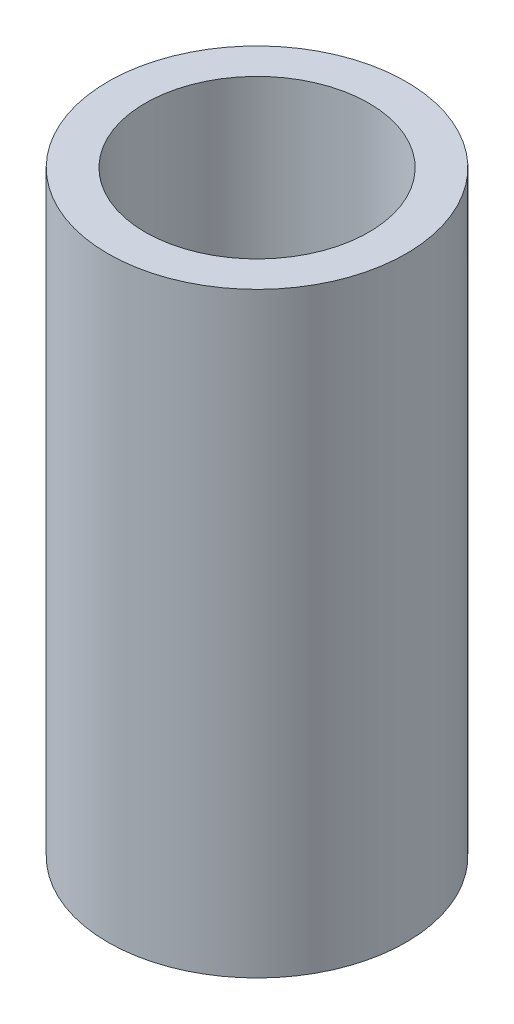
ISO-10303-21;
HEADER;
FILE_DESCRIPTION(('STEP AP214'),'2;1');
FILE_NAME('part.step','',(''),(''),'','','');
FILE_SCHEMA(('AUTOMOTIVE_DESIGN { 1 0 10303 214 1 1 1 1 }'));
ENDSEC;
DATA;
#1=APPLICATION_CONTEXT('core data for automotive mechanical design processes');
#2=APPLICATION_PROTOCOL_DEFINITION('international standard','automotive_design',2000,#1);
#3=PRODUCT_CONTEXT('',#1,'mechanical');
#4=PRODUCT('Part','Part','',(#3));
#5=PRODUCT_RELATED_PRODUCT_CATEGORY('part','',(#4));
#6=PRODUCT_DEFINITION_FORMATION('','',#4);
#7=PRODUCT_DEFINITION_CONTEXT('part definition',#1,'design');
#8=PRODUCT_DEFINITION('design','',#6,#7);
#9=PRODUCT_DEFINITION_SHAPE('','',#8);
#10=(LENGTH_UNIT() NAMED_UNIT(*) SI_UNIT(.MILLI.,.METRE.));
#11=(NAMED_UNIT(*) PLANE_ANGLE_UNIT() SI_UNIT($,.RADIAN.));
#12=(NAMED_UNIT(*) SI_UNIT($,.STERADIAN.) SOLID_ANGLE_UNIT());
#13=UNCERTAINTY_MEASURE_WITH_UNIT(LENGTH_MEASURE(1.E-05),#10,'distance_accuracy_value','');
#14=(GEOMETRIC_REPRESENTATION_CONTEXT(3) GLOBAL_UNCERTAINTY_ASSIGNED_CONTEXT((#13)) GLOBAL_UNIT_ASSIGNED_CONTEXT((#10,
#11,#12)) REPRESENTATION_CONTEXT('',''));
#15=CARTESIAN_POINT('',(0.,0.,0.));
#16=DIRECTION('',(0.,0.,1.));
#17=DIRECTION('',(1.,0.,0.));
#18=AXIS2_PLACEMENT_3D('',#15,#16,#17);
#19=CARTESIAN_POINT('',(0.,50.8,0.));
#20=DIRECTION('',(0.,-1.,0.));
#21=DIRECTION('',(0.,0.,-1.));
#22=AXIS2_PLACEMENT_3D('',#19,#20,#21);
#23=CYLINDRICAL_SURFACE('',#22,12.7);
#24=CARTESIAN_POINT('',(0.,50.8,0.));
#25=DIRECTION('',(0.,1.,0.));
#26=DIRECTION('',(0.,0.,1.));
#27=AXIS2_PLACEMENT_3D('',#24,#25,#26);
#28=CIRCLE('',#27,12.7);
#29=CARTESIAN_POINT('',(0.,50.8,12.7));
#30=VERTEX_POINT('',#29);
#31=EDGE_CURVE('E10',#30,#30,#28,.T.);
#32=ORIENTED_EDGE('',*,*,#31,.F.);
#33=EDGE_LOOP('',(#32));
#34=FACE_BOUND('',#33,.T.);
#35=CARTESIAN_POINT('',(0.,0.,0.));
#36=DIRECTION('',(0.,1.,0.));
#37=DIRECTION('',(0.,0.,1.));
#38=AXIS2_PLACEMENT_3D('',#35,#36,#37);
#39=CIRCLE('',#38,12.7);
#40=CARTESIAN_POINT('',(0.,0.,12.7));
#41=VERTEX_POINT('',#40);
#42=EDGE_CURVE('E35',#41,#41,#39,.T.);
#43=ORIENTED_EDGE('',*,*,#42,.T.);
#44=EDGE_LOOP('',(#43));
#45=FACE_BOUND('',#44,.T.);
#46=ADVANCED_FACE('F28',(#34,#45),#23,.T.);
#47=CARTESIAN_POINT('',(0.,50.8,0.));
#48=DIRECTION('',(0.,1.,0.));
#49=DIRECTION('',(0.,0.,1.));
#50=AXIS2_PLACEMENT_3D('',#47,#48,#49);
#51=PLANE('',#50);
#52=CARTESIAN_POINT('',(0.,50.8,0.));
#53=DIRECTION('',(0.,1.,0.));
#54=DIRECTION('',(0.,0.,1.));
#55=AXIS2_PLACEMENT_3D('',#52,#53,#54);
#56=CIRCLE('',#55,9.525);
#57=CARTESIAN_POINT('',(0.,50.8,9.525));
#58=VERTEX_POINT('',#57);
#59=EDGE_CURVE('E40',#58,#58,#56,.T.);
#60=ORIENTED_EDGE('',*,*,#59,.F.);
#61=EDGE_LOOP('',(#60));
#62=FACE_BOUND('',#61,.T.);
#63=ORIENTED_EDGE('',*,*,#31,.T.);
#64=EDGE_LOOP('',(#63));
#65=FACE_BOUND('',#64,.T.);
#66=ADVANCED_FACE('F72',(#62,#65),#51,.T.);
#67=CARTESIAN_POINT('',(0.,0.,0.));
#68=DIRECTION('',(0.,1.,0.));
#69=DIRECTION('',(0.,0.,1.));
#70=AXIS2_PLACEMENT_3D('',#67,#68,#69);
#71=PLANE('',#70);
#72=CARTESIAN_POINT('',(0.,0.,0.));
#73=DIRECTION('',(0.,-1.,0.));
#74=DIRECTION('',(0.,0.,-1.));
#75=AXIS2_PLACEMENT_3D('',#72,#73,#74);
#76=CIRCLE('',#75,3.571875);
#77=CARTESIAN_POINT('',(0.,0.,-3.571875));
#78=VERTEX_POINT('',#77);
#79=EDGE_CURVE('E61',#78,#78,#76,.T.);
#80=ORIENTED_EDGE('',*,*,#79,.F.);
#81=EDGE_LOOP('',(#80));
#82=FACE_BOUND('',#81,.T.);
#83=CARTESIAN_POINT('',(0.,0.,-7.14375));
#84=DIRECTION('',(0.,-1.,0.));
#85=DIRECTION('',(0.,0.,-1.));
#86=AXIS2_PLACEMENT_3D('',#83,#84,#85);
#87=CIRCLE('',#86,1.13029999999999);
#88=CARTESIAN_POINT('',(0.,0.,-8.27404999999999));
#89=VERTEX_POINT('',#88);
#90=EDGE_CURVE('E51',#89,#89,#87,.T.);
#91=ORIENTED_EDGE('',*,*,#90,.F.);
#92=EDGE_LOOP('',(#91));
#93=FACE_BOUND('',#92,.T.);
#94=CARTESIAN_POINT('',(0.,0.,7.14375));
#95=DIRECTION('',(0.,-1.,0.));
#96=DIRECTION('',(0.,0.,-1.));
#97=AXIS2_PLACEMENT_3D('',#94,#95,#96);
#98=CIRCLE('',#97,1.13029999999999);
#99=CARTESIAN_POINT('',(0.,0.,6.01345000000001));
#100=VERTEX_POINT('',#99);
#101=EDGE_CURVE('E48',#100,#100,#98,.T.);
#102=ORIENTED_EDGE('',*,*,#101,.F.);
#103=EDGE_LOOP('',(#102));
#104=FACE_BOUND('',#103,.T.);
#105=ORIENTED_EDGE('',*,*,#42,.F.);
#106=EDGE_LOOP('',(#105));
#107=FACE_BOUND('',#106,.T.);
#108=ADVANCED_FACE('F74',(#82,#93,#104,#107),#71,.F.);
#109=CARTESIAN_POINT('',(0.,50.8,0.));
#110=DIRECTION('',(0.,-1.,0.));
#111=DIRECTION('',(0.,0.,-1.));
#112=AXIS2_PLACEMENT_3D('',#109,#110,#111);
#113=CYLINDRICAL_SURFACE('',#112,9.525);
#114=ORIENTED_EDGE('',*,*,#59,.T.);
#115=EDGE_LOOP('',(#114));
#116=FACE_BOUND('',#115,.T.);
#117=CARTESIAN_POINT('',(0.,3.175,0.));
#118=DIRECTION('',(0.,1.,0.));
#119=DIRECTION('',(0.,0.,1.));
#120=AXIS2_PLACEMENT_3D('',#117,#118,#119);
#121=CIRCLE('',#120,9.525);
#122=CARTESIAN_POINT('',(0.,3.175,9.525));
#123=VERTEX_POINT('',#122);
#124=EDGE_CURVE('E47',#123,#123,#121,.T.);
#125=ORIENTED_EDGE('',*,*,#124,.F.);
#126=EDGE_LOOP('',(#125));
#127=FACE_BOUND('',#126,.T.);
#128=ADVANCED_FACE('F69',(#116,#127),#113,.F.);
#129=CARTESIAN_POINT('',(0.,3.175,0.));
#130=DIRECTION('',(0.,1.,0.));
#131=DIRECTION('',(0.,0.,1.));
#132=AXIS2_PLACEMENT_3D('',#129,#130,#131);
#133=PLANE('',#132);
#134=CARTESIAN_POINT('',(0.,3.175,0.));
#135=DIRECTION('',(0.,1.,0.));
#136=DIRECTION('',(0.,0.,1.));
#137=AXIS2_PLACEMENT_3D('',#134,#135,#136);
#138=CIRCLE('',#137,3.571875);
#139=CARTESIAN_POINT('',(0.,3.175,3.571875));
#140=VERTEX_POINT('',#139);
#141=EDGE_CURVE('E31',#140,#140,#138,.T.);
#142=ORIENTED_EDGE('',*,*,#141,.F.);
#143=EDGE_LOOP('',(#142));
#144=FACE_BOUND('',#143,.T.);
#145=CARTESIAN_POINT('',(0.,3.175,-7.14375));
#146=DIRECTION('',(0.,1.,0.));
#147=DIRECTION('',(0.,0.,1.));
#148=AXIS2_PLACEMENT_3D('',#145,#146,#147);
#149=CIRCLE('',#148,1.13029999999999);
#150=CARTESIAN_POINT('',(0.,3.175,-6.01345000000001));
#151=VERTEX_POINT('',#150);
#152=EDGE_CURVE('E49',#151,#151,#149,.T.);
#153=ORIENTED_EDGE('',*,*,#152,.F.);
#154=EDGE_LOOP('',(#153));
#155=FACE_BOUND('',#154,.T.);
#156=CARTESIAN_POINT('',(0.,3.175,7.14375));
#157=DIRECTION('',(0.,1.,0.));
#158=DIRECTION('',(0.,0.,1.));
#159=AXIS2_PLACEMENT_3D('',#156,#157,#158);
#160=CIRCLE('',#159,1.13029999999999);
#161=CARTESIAN_POINT('',(0.,3.175,8.27404999999999));
#162=VERTEX_POINT('',#161);
#163=EDGE_CURVE('E45',#162,#162,#160,.T.);
#164=ORIENTED_EDGE('',*,*,#163,.F.);
#165=EDGE_LOOP('',(#164));
#166=FACE_BOUND('',#165,.T.);
#167=ORIENTED_EDGE('',*,*,#124,.T.);
#168=EDGE_LOOP('',(#167));
#169=FACE_BOUND('',#168,.T.);
#170=ADVANCED_FACE('F83',(#144,#155,#166,#169),#133,.T.);
#171=CARTESIAN_POINT('',(0.,0.,7.14375));
#172=DIRECTION('',(0.,-1.,0.));
#173=DIRECTION('',(0.,0.,-1.));
#174=AXIS2_PLACEMENT_3D('',#171,#172,#173);
#175=CYLINDRICAL_SURFACE('',#174,1.13029999999999);
#176=ORIENTED_EDGE('',*,*,#163,.T.);
#177=EDGE_LOOP('',(#176));
#178=FACE_BOUND('',#177,.T.);
#179=ORIENTED_EDGE('',*,*,#101,.T.);
#180=EDGE_LOOP('',(#179));
#181=FACE_BOUND('',#180,.T.);
#182=ADVANCED_FACE('F86',(#178,#181),#175,.F.);
#183=CARTESIAN_POINT('',(0.,0.,-7.14375));
#184=DIRECTION('',(0.,-1.,0.));
#185=DIRECTION('',(0.,0.,-1.));
#186=AXIS2_PLACEMENT_3D('',#183,#184,#185);
#187=CYLINDRICAL_SURFACE('',#186,1.13029999999999);
#188=ORIENTED_EDGE('',*,*,#152,.T.);
#189=EDGE_LOOP('',(#188));
#190=FACE_BOUND('',#189,.T.);
#191=ORIENTED_EDGE('',*,*,#90,.T.);
#192=EDGE_LOOP('',(#191));
#193=FACE_BOUND('',#192,.T.);
#194=ADVANCED_FACE('F92',(#190,#193),#187,.F.);
#195=CARTESIAN_POINT('',(0.,50.8,0.));
#196=DIRECTION('',(0.,-1.,0.));
#197=DIRECTION('',(0.,0.,-1.));
#198=AXIS2_PLACEMENT_3D('',#195,#196,#197);
#199=CYLINDRICAL_SURFACE('',#198,3.571875);
#200=ORIENTED_EDGE('',*,*,#141,.T.);
#201=EDGE_LOOP('',(#200));
#202=FACE_BOUND('',#201,.T.);
#203=ORIENTED_EDGE('',*,*,#79,.T.);
#204=EDGE_LOOP('',(#203));
#205=FACE_BOUND('',#204,.T.);
#206=ADVANCED_FACE('F96',(#202,#205),#199,.F.);
#207=CLOSED_SHELL('',(#46,#66,#108,#128,#170,#182,#194,#206));
#208=MANIFOLD_SOLID_BREP('B2',#207);
#209=ADVANCED_BREP_SHAPE_REPRESENTATION('',(#18,#208),#14);
#210=SHAPE_DEFINITION_REPRESENTATION(#9,#209);
ENDSEC;
END-ISO-10303-21;
